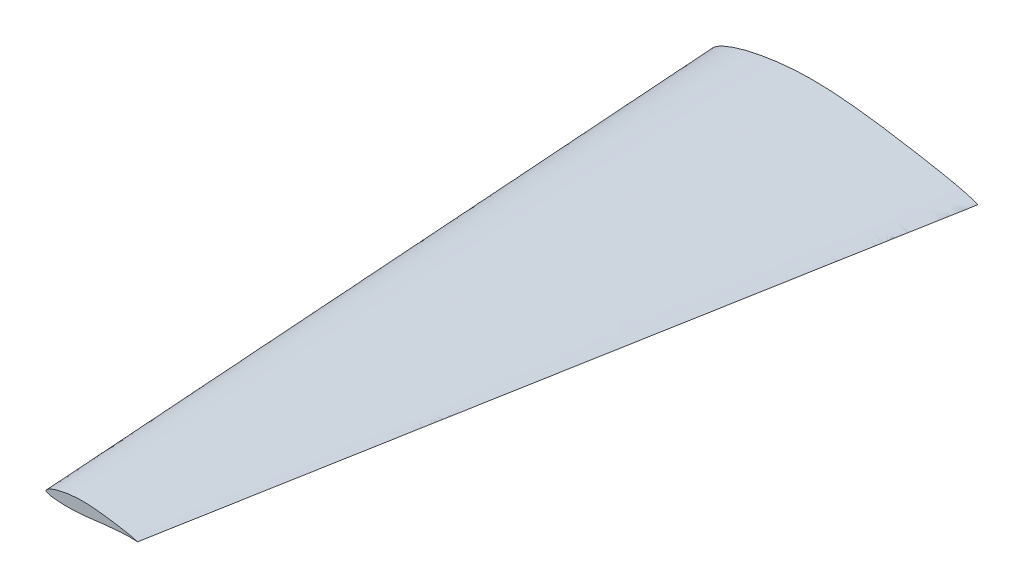
ISO-10303-21;
HEADER;
FILE_DESCRIPTION(('STEP AP214'),'2;1');
FILE_NAME('part.step','',(''),(''),'','','');
FILE_SCHEMA(('AUTOMOTIVE_DESIGN { 1 0 10303 214 1 1 1 1 }'));
ENDSEC;
DATA;
#1=APPLICATION_CONTEXT('core data for automotive mechanical design processes');
#2=APPLICATION_PROTOCOL_DEFINITION('international standard','automotive_design',2000,#1);
#3=PRODUCT_CONTEXT('',#1,'mechanical');
#4=PRODUCT('Part','Part','',(#3));
#5=PRODUCT_RELATED_PRODUCT_CATEGORY('part','',(#4));
#6=PRODUCT_DEFINITION_FORMATION('','',#4);
#7=PRODUCT_DEFINITION_CONTEXT('part definition',#1,'design');
#8=PRODUCT_DEFINITION('design','',#6,#7);
#9=PRODUCT_DEFINITION_SHAPE('','',#8);
#10=(LENGTH_UNIT() NAMED_UNIT(*) SI_UNIT(.MILLI.,.METRE.));
#11=(NAMED_UNIT(*) PLANE_ANGLE_UNIT() SI_UNIT($,.RADIAN.));
#12=(NAMED_UNIT(*) SI_UNIT($,.STERADIAN.) SOLID_ANGLE_UNIT());
#13=UNCERTAINTY_MEASURE_WITH_UNIT(LENGTH_MEASURE(1.E-05),#10,'distance_accuracy_value','');
#14=(GEOMETRIC_REPRESENTATION_CONTEXT(3) GLOBAL_UNCERTAINTY_ASSIGNED_CONTEXT((#13)) GLOBAL_UNIT_ASSIGNED_CONTEXT((#10,
#11,#12)) REPRESENTATION_CONTEXT('',''));
#15=CARTESIAN_POINT('',(0.,0.,0.));
#16=DIRECTION('',(0.,0.,1.));
#17=DIRECTION('',(1.,0.,0.));
#18=AXIS2_PLACEMENT_3D('',#15,#16,#17);
#19=CARTESIAN_POINT('',(-747.653077521207,-40.6182657315667,6200.));
#20=DIRECTION('',(0.,0.,-1.));
#21=DIRECTION('',(-1.,0.,0.));
#22=AXIS2_PLACEMENT_3D('',#19,#20,#21);
#23=PLANE('',#22);
#24=CARTESIAN_POINT('',(46.231204019507,-35.2354448345607,6200.));
#25=CARTESIAN_POINT('',(46.2284405656363,-35.161464044046,6200.));
#26=CARTESIAN_POINT('',(40.5107466597847,-33.7410304315181,6200.));
#27=CARTESIAN_POINT('',(35.095173755005,-31.6670699807893,6200.));
#28=CARTESIAN_POINT('',(22.6401533138637,-27.6181263346662,6200.));
#29=CARTESIAN_POINT('',(7.68738653694873,-23.4228917248776,6200.));
#30=CARTESIAN_POINT('',(-11.6630288456523,-19.1093216631822,6200.));
#31=CARTESIAN_POINT('',(-34.5376973183015,-14.4997928532483,6200.));
#32=CARTESIAN_POINT('',(-60.9676577726097,-9.5372939208794,6200.));
#33=CARTESIAN_POINT('',(-90.4748945702333,-4.29466001199642,6200.));
#34=CARTESIAN_POINT('',(-122.673585589033,1.13715909285272,6200.));
#35=CARTESIAN_POINT('',(-157.103341203516,6.66239247620247,6200.));
#36=CARTESIAN_POINT('',(-193.315298237174,12.1170555043395,6200.));
#37=CARTESIAN_POINT('',(-230.831801501577,17.3685612770775,6200.));
#38=CARTESIAN_POINT('',(-269.195458339637,22.2344819950382,6200.));
#39=CARTESIAN_POINT('',(-307.948301893932,26.5125347132972,6200.));
#40=CARTESIAN_POINT('',(-346.653804819708,30.0334858752315,6200.));
#41=CARTESIAN_POINT('',(-384.937273776908,32.5535580846316,6200.));
#42=CARTESIAN_POINT('',(-422.514475712798,33.7529045585345,6200.));
#43=CARTESIAN_POINT('',(-459.17152624748,33.5367452774346,6200.));
#44=CARTESIAN_POINT('',(-494.752795326995,31.8255847079449,6200.));
#45=CARTESIAN_POINT('',(-529.085531914352,28.6992408412461,6200.));
#46=CARTESIAN_POINT('',(-561.953763146873,24.4271493642645,6200.));
#47=CARTESIAN_POINT('',(-593.076940726259,19.2471852213284,6200.));
#48=CARTESIAN_POINT('',(-622.123955821754,13.2516082607377,6200.));
#49=CARTESIAN_POINT('',(-648.800228679982,6.62191851956731,6200.));
#50=CARTESIAN_POINT('',(-672.832873554333,-0.503051287442359,6200.));
#51=CARTESIAN_POINT('',(-693.96618270177,-7.97014647053786,6200.));
#52=CARTESIAN_POINT('',(-711.995202148996,-15.6130550209624,6200.));
#53=CARTESIAN_POINT('',(-726.74658265942,-23.3233108305785,6200.));
#54=CARTESIAN_POINT('',(-738.094871742379,-30.9123353139702,6200.));
#55=CARTESIAN_POINT('',(-744.610586604553,-36.8048992419908,6200.));
#56=CARTESIAN_POINT('',(-748.201788544685,-41.2650967461758,6200.));
#57=CARTESIAN_POINT('',(-749.850318344285,-43.828182757875,6200.));
#58=CARTESIAN_POINT('',(-750.94828793429,-46.5664283398626,6200.));
#59=CARTESIAN_POINT('',(-751.250483793828,-48.2430082792743,6200.));
#60=CARTESIAN_POINT('',(-751.171358916499,-49.4139312981977,6200.));
#61=CARTESIAN_POINT('',(-750.685133378202,-50.5092914480428,6200.));
#62=CARTESIAN_POINT('',(-749.565856882824,-51.9098735302076,6200.));
#63=CARTESIAN_POINT('',(-747.191277168439,-54.0288947151431,6200.));
#64=CARTESIAN_POINT('',(-742.501078818877,-56.9533147580623,6200.));
#65=CARTESIAN_POINT('',(-733.868548954772,-60.6081626209987,6200.));
#66=CARTESIAN_POINT('',(-720.75844147582,-64.3709023541952,6200.));
#67=CARTESIAN_POINT('',(-703.184436093652,-67.8446748921428,6200.));
#68=CARTESIAN_POINT('',(-681.911582287878,-70.772200095514,6200.));
#69=CARTESIAN_POINT('',(-657.177051439535,-73.2167412462913,6200.));
#70=CARTESIAN_POINT('',(-629.276219223052,-75.1132874538173,6200.));
#71=CARTESIAN_POINT('',(-598.56561876685,-76.4014909147392,6200.));
#72=CARTESIAN_POINT('',(-565.43017274413,-77.0190676374616,6200.));
#73=CARTESIAN_POINT('',(-530.228914169513,-76.8125475071701,6200.));
#74=CARTESIAN_POINT('',(-493.270160843118,-75.5698410912889,6200.));
#75=CARTESIAN_POINT('',(-454.771507600199,-73.1566453823038,6200.));
#76=CARTESIAN_POINT('',(-414.862090680234,-69.4705576020164,6200.));
#77=CARTESIAN_POINT('',(-373.676106035862,-64.6873134822189,6200.));
#78=CARTESIAN_POINT('',(-331.439275690689,-59.4377296716919,6200.));
#79=CARTESIAN_POINT('',(-288.614659582081,-54.0859694749774,6200.));
#80=CARTESIAN_POINT('',(-245.801574741511,-48.9603022904963,6200.));
#81=CARTESIAN_POINT('',(-203.641252257449,-44.2739171415237,6200.));
#82=CARTESIAN_POINT('',(-162.796442142331,-40.2654907769843,6200.));
#83=CARTESIAN_POINT('',(-123.942495214821,-37.0545696704387,6200.));
#84=CARTESIAN_POINT('',(-87.7619223828843,-34.6928701852552,6200.));
#85=CARTESIAN_POINT('',(-54.8545790950461,-33.2402187187982,6200.));
#86=CARTESIAN_POINT('',(-25.9538233844276,-32.5683565258773,6200.));
#87=CARTESIAN_POINT('',(-1.22814621466564,-32.6492910205264,6200.));
#88=CARTESIAN_POINT('',(17.844561028956,-33.0455684548176,6200.));
#89=CARTESIAN_POINT('',(33.4506324915198,-34.0613780335465,6200.));
#90=CARTESIAN_POINT('',(39.9102962245878,-34.3503679361492,6200.));
#91=CARTESIAN_POINT('',(46.2340585822929,-35.311864713945,6200.));
#92=CARTESIAN_POINT('',(46.231204019507,-35.2354448345607,6200.));
#93=B_SPLINE_CURVE_WITH_KNOTS('',3,(#24,#25,#26,#27,#28,#29,#30,#31,#32,#33,#34,#35,#36,#37,#38,
#39,#40,#41,#42,#43,#44,#45,#46,#47,#48,#49,#50,#51,#52,#53,#54,#55,#56,#57,#58,#59,#60,#61,#62,
#63,#64,#65,#66,#67,#68,#69,#70,#71,#72,#73,#74,#75,#76,#77,#78,#79,#80,#81,#82,#83,#84,#85,#86,
#87,#88,#89,#90,#91,#92),.UNSPECIFIED.,.T.,.F.,(4,1,1,1,1,1,1,1,1,1,1,1,1,1,1,1,1,1,1,1,1,1,1,1,
1,1,1,1,1,1,1,1,1,1,1,1,1,1,1,1,1,1,1,1,1,1,1,1,1,1,1,1,1,1,1,1,1,1,1,1,1,1,1,1,1,1,4),(0.,
0.00178025429931348,0.00677661855276226,0.014307631931115,0.0240462466109695,0.0361164032384218,
0.0505469730630571,0.0671298835400742,0.0856244289456062,0.10576729194862,0.127282098412942,
0.149864114045041,0.173229760189317,0.197069077892929,0.221103034083199,0.245051957369849,
0.268663179942347,0.291772797822348,0.314298508345449,0.336177511433891,0.357377359215959,
0.377791670496789,0.397224888102935,0.415489312865215,0.432417328029751,0.447849235180273,
0.461650757544391,0.473686992386839,0.483898395757803,0.492262508108233,0.498796820958936,
0.499955027372734,0.502810607326279,0.504371243067385,0.50535998755193,0.505924933279694,
0.506503368203689,0.507535007041587,0.509204749770686,0.512345281497249,0.517665407870953,
0.526421681932562,0.537424925562334,0.550643204547595,0.565965823835836,0.583206168779579,
0.6021549785986,0.622586582637333,0.644254823208852,0.666997978581174,0.690702845759673,
0.715307475272001,0.740824202204505,0.767084355637659,0.793717038600972,0.82033109971691,
0.846519300878587,0.871863223081629,0.895937170924907,0.918334876492831,0.938667169413558,
0.956573464196435,0.971715275283217,0.983839006179547,0.992717916559063,0.998161052107173,1.),.UNSPECIFIED.);
#94=CARTESIAN_POINT('',(46.231204019507,-35.2354448345607,6200.));
#95=VERTEX_POINT('',#94);
#96=EDGE_CURVE('E11',#95,#95,#93,.T.);
#97=ORIENTED_EDGE('',*,*,#96,.T.);
#98=EDGE_LOOP('',(#97));
#99=FACE_BOUND('',#98,.T.);
#100=ADVANCED_FACE('F49',(#99),#23,.F.);
#101=CARTESIAN_POINT('',(-1152.13318667176,-13.10991310776,0.));
#102=DIRECTION('',(0.,0.,-1.));
#103=DIRECTION('',(-1.,0.,0.));
#104=AXIS2_PLACEMENT_3D('',#101,#102,#103);
#105=PLANE('',#104);
#106=CARTESIAN_POINT('',(1167.2058981927,-30.8287655417814,0.));
#107=CARTESIAN_POINT('',(1167.20094205409,-30.6125348061449,0.));
#108=CARTESIAN_POINT('',(1150.55812547847,-26.2222684266974,0.));
#109=CARTESIAN_POINT('',(1134.82540200827,-19.935632175429,0.));
#110=CARTESIAN_POINT('',(1098.6120870386,-7.58308667640115,0.));
#111=CARTESIAN_POINT('',(1055.10846288295,5.30202759492293,0.));
#112=CARTESIAN_POINT('',(998.763315338816,18.7180818982876,0.));
#113=CARTESIAN_POINT('',(932.135509290922,33.1471605686924,0.));
#114=CARTESIAN_POINT('',(855.136774910614,48.7571140419909,0.));
#115=CARTESIAN_POINT('',(769.160433794038,65.3150377322802,0.));
#116=CARTESIAN_POINT('',(675.329726698728,82.5389939377325,0.));
#117=CARTESIAN_POINT('',(574.985519526962,100.129820104777,0.));
#118=CARTESIAN_POINT('',(469.432133283733,117.589571827369,0.));
#119=CARTESIAN_POINT('',(360.059319501105,134.510811557431,0.));
#120=CARTESIAN_POINT('',(248.195538752362,150.341358991376,0.));
#121=CARTESIAN_POINT('',(135.170092557183,164.471008346329,0.));
#122=CARTESIAN_POINT('',(22.2510450991397,176.387001607296,0.));
#123=CARTESIAN_POINT('',(-89.4773105438022,185.36142647281,0.));
#124=CARTESIAN_POINT('',(-199.198140394845,190.447965807139,0.));
#125=CARTESIAN_POINT('',(-306.290633386234,191.360736000371,0.));
#126=CARTESIAN_POINT('',(-410.303508399844,187.860956850583,0.));
#127=CARTESIAN_POINT('',(-510.728758861772,180.174517107883,0.));
#128=CARTESIAN_POINT('',(-606.924129786052,169.079400162372,0.));
#129=CARTESIAN_POINT('',(-698.060056527238,155.258673151785,0.));
#130=CARTESIAN_POINT('',(-783.165410093493,138.967899254407,0.));
#131=CARTESIAN_POINT('',(-861.372011698718,120.724870890821,0.));
#132=CARTESIAN_POINT('',(-931.876852978271,100.923653640039,0.));
#133=CARTESIAN_POINT('',(-993.926503002303,80.0008743940595,0.));
#134=CARTESIAN_POINT('',(-1046.91523960918,58.4337335558672,0.));
#135=CARTESIAN_POINT('',(-1090.33210191695,36.5317821888165,0.));
#136=CARTESIAN_POINT('',(-1123.8026712494,14.8406154016031,0.));
#137=CARTESIAN_POINT('',(-1143.08475254185,-2.09839090037191,0.));
#138=CARTESIAN_POINT('',(-1153.7633419372,-14.9763351096262,0.));
#139=CARTESIAN_POINT('',(-1158.68703654053,-22.3942325025825,0.));
#140=CARTESIAN_POINT('',(-1162.00980127258,-30.3470028754014,0.));
#141=CARTESIAN_POINT('',(-1162.96321031832,-35.2319349474596,0.));
#142=CARTESIAN_POINT('',(-1162.78139542472,-38.6557944007734,0.));
#143=CARTESIAN_POINT('',(-1161.40716590262,-41.8760675021992,0.));
#144=CARTESIAN_POINT('',(-1158.19651173585,-46.0146296484932,0.));
#145=CARTESIAN_POINT('',(-1151.34910308779,-52.3047930563116,0.));
#146=CARTESIAN_POINT('',(-1137.77118638329,-61.0452534655465,0.));
#147=CARTESIAN_POINT('',(-1112.70761372977,-72.0855309303668,0.));
#148=CARTESIAN_POINT('',(-1074.56858735021,-83.6296075048392,0.));
#149=CARTESIAN_POINT('',(-1023.37735058653,-94.5175934332822,0.));
#150=CARTESIAN_POINT('',(-961.357944689747,-103.965687711033,0.));
#151=CARTESIAN_POINT('',(-889.205864982308,-112.148705326003,0.));
#152=CARTESIAN_POINT('',(-807.781230762513,-118.864291993696,0.));
#153=CARTESIAN_POINT('',(-718.123012274133,-123.92113901691,0.));
#154=CARTESIAN_POINT('',(-621.353030363154,-127.121085721016,0.));
#155=CARTESIAN_POINT('',(-518.513635114154,-128.000687141774,0.));
#156=CARTESIAN_POINT('',(-410.4965568004,-125.92739470241,0.));
#157=CARTESIAN_POINT('',(-297.931780603609,-120.499713058915,0.));
#158=CARTESIAN_POINT('',(-181.192228331441,-111.413060940735,0.));
#159=CARTESIAN_POINT('',(-60.6773192350566,-99.1751483002546,0.));
#160=CARTESIAN_POINT('',(62.9269886556645,-85.6192218943303,0.));
#161=CARTESIAN_POINT('',(188.252653618113,-71.7895767046168,0.));
#162=CARTESIAN_POINT('',(313.535108762903,-58.6199136567897,0.));
#163=CARTESIAN_POINT('',(436.892194820228,-46.7059926617858,0.));
#164=CARTESIAN_POINT('',(556.377817264392,-36.7171224297439,0.));
#165=CARTESIAN_POINT('',(670.014090312546,-28.9740748515905,0.));
#166=CARTESIAN_POINT('',(775.805069390217,-23.5991733728416,0.));
#167=CARTESIAN_POINT('',(871.995923235459,-20.7419146039119,0.));
#168=CARTESIAN_POINT('',(956.449753180622,-19.9967327290336,0.));
#169=CARTESIAN_POINT('',(1028.67553891412,-21.2747573154828,0.));
#170=CARTESIAN_POINT('',(1084.37445965471,-23.2358309601832,0.));
#171=CARTESIAN_POINT('',(1129.92046876616,-26.8606596821739,0.));
#172=CARTESIAN_POINT('',(1148.77840735508,-27.9769839768032,0.));
#173=CARTESIAN_POINT('',(1167.21101773133,-31.0521252358525,0.));
#174=CARTESIAN_POINT('',(1167.2058981927,-30.8287655417814,0.));
#175=B_SPLINE_CURVE_WITH_KNOTS('',3,(#106,#107,#108,#109,#110,#111,#112,#113,#114,#115,#116,
#117,#118,#119,#120,#121,#122,#123,#124,#125,#126,#127,#128,#129,#130,#131,#132,#133,#134,#135,
#136,#137,#138,#139,#140,#141,#142,#143,#144,#145,#146,#147,#148,#149,#150,#151,#152,#153,#154,
#155,#156,#157,#158,#159,#160,#161,#162,#163,#164,#165,#166,#167,#168,#169,#170,#171,#172,#173,
#174),.UNSPECIFIED.,.T.,.F.,(4,1,1,1,1,1,1,1,1,1,1,1,1,1,1,1,1,1,1,1,1,1,1,1,1,1,1,1,1,1,1,1,1,
1,1,1,1,1,1,1,1,1,1,1,1,1,1,1,1,1,1,1,1,1,1,1,1,1,1,1,1,1,1,1,1,1,4),(0.,0.00178025429931348,
0.00677661855276226,0.014307631931115,0.0240462466109695,0.0361164032384218,0.0505469730630571,
0.0671298835400742,0.0856244289456062,0.10576729194862,0.127282098412942,0.149864114045041,
0.173229760189317,0.197069077892929,0.221103034083199,0.245051957369849,0.268663179942347,
0.291772797822348,0.314298508345449,0.336177511433891,0.357377359215959,0.377791670496789,
0.397224888102935,0.415489312865215,0.432417328029751,0.447849235180273,0.461650757544391,
0.473686992386839,0.483898395757803,0.492262508108233,0.498796820958936,0.499955027372734,
0.502810607326279,0.504371243067385,0.50535998755193,0.505924933279694,0.506503368203689,
0.507535007041587,0.509204749770686,0.512345281497249,0.517665407870953,0.526421681932562,
0.537424925562334,0.550643204547595,0.565965823835836,0.583206168779579,0.6021549785986,
0.622586582637333,0.644254823208852,0.666997978581174,0.690702845759673,0.715307475272001,
0.740824202204505,0.767084355637659,0.793717038600972,0.82033109971691,0.846519300878587,
0.871863223081629,0.895937170924907,0.918334876492831,0.938667169413558,0.956573464196435,
0.971715275283217,0.983839006179547,0.992717916559063,0.998161052107173,1.),.UNSPECIFIED.);
#176=CARTESIAN_POINT('',(1167.2058981927,-30.8287655417814,0.));
#177=VERTEX_POINT('',#176);
#178=EDGE_CURVE('E60',#177,#177,#175,.T.);
#179=ORIENTED_EDGE('',*,*,#178,.F.);
#180=EDGE_LOOP('',(#179));
#181=FACE_BOUND('',#180,.T.);
#182=ADVANCED_FACE('F89',(#181),#105,.T.);
#183=CARTESIAN_POINT('',(-1162.80093681062,-35.1631921790562,0.));
#184=CARTESIAN_POINT('',(-751.127407137551,-47.6464509229914,6200.));
#185=CARTESIAN_POINT('',(-1162.82218379801,-35.4148684875712,0.));
#186=CARTESIAN_POINT('',(-751.14142513213,-47.7317010378396,6200.));
#187=CARTESIAN_POINT('',(-1162.87189893173,-36.2284220161607,0.));
#188=CARTESIAN_POINT('',(-751.181479745274,-48.0073492187059,6200.));
#189=CARTESIAN_POINT('',(-1162.84876824659,-37.3870585535843,0.));
#190=CARTESIAN_POINT('',(-751.212003010877,-48.4002126372902,6200.));
#191=CARTESIAN_POINT('',(-1162.61538645023,-38.8260829593911,0.));
#192=CARTESIAN_POINT('',(-751.205936581557,-48.9022365528266,6200.));
#193=CARTESIAN_POINT('',(-1162.20122176191,-40.0153326805554,0.));
#194=CARTESIAN_POINT('',(-751.149350948429,-49.3294659917411,6200.));
#195=CARTESIAN_POINT('',(-1161.5415607564,-41.3501189108856,0.));
#196=CARTESIAN_POINT('',(-750.994737816625,-49.8118201361654,6200.));
#197=CARTESIAN_POINT('',(-1160.49507255786,-43.0517640407889,0.));
#198=CARTESIAN_POINT('',(-750.693102250106,-50.4312829941758,6200.));
#199=CARTESIAN_POINT('',(-1159.10433634,-44.7657984056075,0.));
#200=CARTESIAN_POINT('',(-750.256246487288,-51.0459696479064,6200.));
#201=CARTESIAN_POINT('',(-1156.5731933585,-47.5058416355701,0.));
#202=CARTESIAN_POINT('',(-749.416488376659,-52.0107554517047,6200.));
#203=CARTESIAN_POINT('',(-1154.1769500547,-49.6523307730814,0.));
#204=CARTESIAN_POINT('',(-748.611427802237,-52.7615844367858,6200.));
#205=CARTESIAN_POINT('',(-1148.6375824423,-54.0502698747751,0.));
#206=CARTESIAN_POINT('',(-746.730863479948,-54.2879264972246,6200.));
#207=CARTESIAN_POINT('',(-1143.93790078237,-57.0324125459158,0.));
#208=CARTESIAN_POINT('',(-745.127778881206,-55.3155216976197,6200.));
#209=CARTESIAN_POINT('',(-1132.68502689756,-63.2856607980921,0.));
#210=CARTESIAN_POINT('',(-741.271616253597,-57.4518931681089,6200.));
#211=CARTESIAN_POINT('',(-1124.41666857986,-66.8979562011114,0.));
#212=CARTESIAN_POINT('',(-738.436071417425,-58.6743610617412,6200.));
#213=CARTESIAN_POINT('',(-1104.0799315644,-74.6969930737921,0.));
#214=CARTESIAN_POINT('',(-731.452005928495,-61.2861024299933,6200.));
#215=CARTESIAN_POINT('',(-1090.22169978196,-78.8689057909252,0.));
#216=CARTESIAN_POINT('',(-726.694952758834,-62.6670607253582,6200.));
#217=CARTESIAN_POINT('',(-1060.4278402018,-86.6372366559048,0.));
#218=CARTESIAN_POINT('',(-716.466679165266,-65.2097515079323,6200.));
#219=CARTESIAN_POINT('',(-1042.79647444445,-90.3716143825966,0.));
#220=CARTESIAN_POINT('',(-710.416790483915,-66.4150887779212,6200.));
#221=CARTESIAN_POINT('',(-1005.56620474238,-97.230960043249,0.));
#222=CARTESIAN_POINT('',(-697.644342595635,-68.6007561784582,6200.));
#223=CARTESIAN_POINT('',(-984.279801732776,-100.463443592199,0.));
#224=CARTESIAN_POINT('',(-690.344479221008,-69.6116826334672,6200.));
#225=CARTESIAN_POINT('',(-939.968877173729,-106.391496044778,0.));
#226=CARTESIAN_POINT('',(-675.151371615518,-71.4362702565338,6200.));
#227=CARTESIAN_POINT('',(-915.262534533087,-109.185210548054,0.));
#228=CARTESIAN_POINT('',(-666.682488130611,-72.2773083825788,6200.));
#229=CARTESIAN_POINT('',(-864.426937652912,-114.192374734008,0.));
#230=CARTESIAN_POINT('',(-649.260178746018,-73.7517046735597,6200.));
#231=CARTESIAN_POINT('',(-836.616183644671,-116.479005488935,0.));
#232=CARTESIAN_POINT('',(-639.73101548564,-74.4026274975686,6200.));
#233=CARTESIAN_POINT('',(-779.921918043632,-120.435595606086,0.));
#234=CARTESIAN_POINT('',(-620.308326956115,-75.486802895482,6200.));
#235=CARTESIAN_POINT('',(-749.356989548695,-122.153094567043,0.));
#236=CARTESIAN_POINT('',(-609.839170905086,-75.9286043978483,6200.));
#237=CARTESIAN_POINT('',(-687.526671639854,-124.932885195187,0.));
#238=CARTESIAN_POINT('',(-588.664210241904,-76.5836753733088,6200.));
#239=CARTESIAN_POINT('',(-654.579763498405,-126.015577223397,0.));
#240=CARTESIAN_POINT('',(-577.382832209052,-76.7962945908848,6200.));
#241=CARTESIAN_POINT('',(-588.388676330774,-127.40303499319,0.));
#242=CARTESIAN_POINT('',(-554.722067026049,-76.9537868757262,6200.));
#243=CARTESIAN_POINT('',(-553.463082381829,-127.694050613575,0.));
#244=CARTESIAN_POINT('',(-542.767268643542,-76.8861080190515,6200.));
#245=CARTESIAN_POINT('',(-483.592413040276,-127.330405119437,0.));
#246=CARTESIAN_POINT('',(-518.85553536317,-76.4273586963049,6200.));
#247=CARTESIAN_POINT('',(-446.966886676244,-126.619332334349,0.));
#248=CARTESIAN_POINT('',(-506.323726287629,-76.00875604561,6200.));
#249=CARTESIAN_POINT('',(-373.906113490436,-124.163065893781,0.));
#250=CARTESIAN_POINT('',(-481.330177815911,-74.8185266368609,6200.));
#251=CARTESIAN_POINT('',(-335.792606005059,-122.317057011245,0.));
#252=CARTESIAN_POINT('',(-468.294534369807,-74.0043038696539,6200.));
#253=CARTESIAN_POINT('',(-259.889195452736,-117.538593796299,0.));
#254=CARTESIAN_POINT('',(-442.339202583138,-72.0054456539621,6200.));
#255=CARTESIAN_POINT('',(-220.424449688419,-114.460196449742,0.));
#256=CARTESIAN_POINT('',(-428.847066353092,-70.7622288894901,6200.));
#257=CARTESIAN_POINT('',(-141.813544032135,-107.414278533103,0.));
#258=CARTESIAN_POINT('',(-401.976193920792,-67.9716757541424,6200.));
#259=CARTESIAN_POINT('',(-100.995999182059,-103.26712330858,0.));
#260=CARTESIAN_POINT('',(-388.026457907883,-66.3539298518788,6200.));
#261=CARTESIAN_POINT('',(-19.8959729918267,-94.7025782269162,0.));
#262=CARTESIAN_POINT('',(-360.311756195002,-63.0254702980006,6200.));
#263=CARTESIAN_POINT('',(22.0572868382875,-90.1012921926885,0.));
#264=CARTESIAN_POINT('',(-345.97580160877,-61.2444635221544,6200.));
#265=CARTESIAN_POINT('',(104.877431201199,-80.9900045976973,0.));
#266=CARTESIAN_POINT('',(-317.67543865908,-57.7176072400212,6200.));
#267=CARTESIAN_POINT('',(147.415245349056,-76.2974479994419,0.));
#268=CARTESIAN_POINT('',(-303.140030241952,-55.9011941659093,6200.));
#269=CARTESIAN_POINT('',(230.814160738487,-67.3155208048084,0.));
#270=CARTESIAN_POINT('',(-274.641213520155,-52.4135466090698,6200.));
#271=CARTESIAN_POINT('',(273.34654561888,-62.8469584398096,0.));
#272=CARTESIAN_POINT('',(-260.106661836917,-50.6729356073692,6200.));
#273=CARTESIAN_POINT('',(356.10424868016,-54.5085538151363,0.));
#274=CARTESIAN_POINT('',(-231.824260001459,-47.4074556833747,6200.));
#275=CARTESIAN_POINT('',(398.001483145769,-50.4658204194294,0.));
#276=CARTESIAN_POINT('',(-217.505056961184,-45.8149662759653,6200.));
#277=CARTESIAN_POINT('',(478.837616492646,-43.1994002756613,0.));
#278=CARTESIAN_POINT('',(-189.875157787999,-42.9241781081205,6200.));
#279=CARTESIAN_POINT('',(519.449125211496,-39.808815896065,0.));
#280=CARTESIAN_POINT('',(-175.992823604059,-41.5605567405333,6200.));
#281=CARTESIAN_POINT('',(597.039432074497,-33.9464858219613,0.));
#282=CARTESIAN_POINT('',(-149.466929054913,-39.1653912946596,6200.));
#283=CARTESIAN_POINT('',(635.691758147447,-31.3178571213149,0.));
#284=CARTESIAN_POINT('',(-136.251337683896,-38.0717822114152,6200.));
#285=CARTESIAN_POINT('',(708.697181241306,-27.0087106546781,0.));
#286=CARTESIAN_POINT('',(-111.286803426713,-36.2300900327708,6200.));
#287=CARTESIAN_POINT('',(744.726286704508,-25.1844843466594,0.));
#288=CARTESIAN_POINT('',(-98.9651052741872,-35.4241618480409,6200.));
#289=CARTESIAN_POINT('',(811.896313393692,-22.5271169424411,0.));
#290=CARTESIAN_POINT('',(-75.9899672258875,-34.1751701427918,6200.));
#291=CARTESIAN_POINT('',(844.710262781509,-21.5587233449551,0.));
#292=CARTESIAN_POINT('',(-64.7640727036485,-33.6776603042969,6200.));
#293=CARTESIAN_POINT('',(904.722881392011,-20.4531469298585,0.));
#294=CARTESIAN_POINT('',(-44.2292297655829,-32.9951221570591,6200.));
#295=CARTESIAN_POINT('',(933.614915270421,-20.2064937713281,0.));
#296=CARTESIAN_POINT('',(-34.3430563613789,-32.763382860872,6200.));
#297=CARTESIAN_POINT('',(985.645245963093,-20.5133426517996,0.));
#298=CARTESIAN_POINT('',(-16.5382582317236,-32.6015550028647,6200.));
#299=CARTESIAN_POINT('',(1010.40894688517,-20.9569515974464,0.));
#300=CARTESIAN_POINT('',(-8.05769346037086,-32.6269358813236,6200.));
#301=CARTESIAN_POINT('',(1052.55365181706,-22.1154690793108,0.));
#302=CARTESIAN_POINT('',(6.38583708555751,-32.8090373118029,6200.));
#303=CARTESIAN_POINT('',(1071.81891508838,-22.8098110488612,0.));
#304=CARTESIAN_POINT('',(12.9729042702342,-32.9443490727743,6200.));
#305=CARTESIAN_POINT('',(1105.86292841497,-24.9460141413969,0.));
#306=CARTESIAN_POINT('',(24.5916797934128,-33.4883744378349,6200.));
#307=CARTESIAN_POINT('',(1121.63655147603,-26.1959565127779,0.));
#308=CARTESIAN_POINT('',(30.03006042549,-33.8387307210732,6200.));
#309=CARTESIAN_POINT('',(1140.69335667294,-27.4983771313504,0.));
#310=CARTESIAN_POINT('',(36.6899311496249,-34.2045790935945,6200.));
#311=CARTESIAN_POINT('',(1147.84079960988,-27.9981008544572,0.));
#312=CARTESIAN_POINT('',(39.0340366974602,-34.3111661810945,6200.));
#313=CARTESIAN_POINT('',(1163.45052073251,-30.42475563168,0.));
#314=CARTESIAN_POINT('',(44.0733446394874,-34.9879008816027,6200.));
#315=CARTESIAN_POINT('',(1167.93232742973,-31.1215007100377,0.));
#316=CARTESIAN_POINT('',(45.9272473515707,-35.2652155843534,6200.));
#317=CARTESIAN_POINT('',(1166.33325094202,-30.3836435544886,0.));
#318=CARTESIAN_POINT('',(46.4680358961861,-35.2384187687712,6200.));
#319=CARTESIAN_POINT('',(1161.2442722409,-29.024594269748,0.));
#320=CARTESIAN_POINT('',(45.0244696021425,-34.8623642927802,6200.));
#321=CARTESIAN_POINT('',(1148.2120545959,-25.2848023683636,0.));
#322=CARTESIAN_POINT('',(40.2341206243334,-33.6034333426219,6200.));
#323=CARTESIAN_POINT('',(1142.25005771613,-22.916800229585,0.));
#324=CARTESIAN_POINT('',(38.0794627096275,-32.8099402503357,6200.));
#325=CARTESIAN_POINT('',(1126.12472065244,-16.96778561373,0.));
#326=CARTESIAN_POINT('',(32.6553805949656,-30.8788003993694,6200.));
#327=CARTESIAN_POINT('',(1113.32486640781,-12.6124338111884,0.));
#328=CARTESIAN_POINT('',(28.2853129879629,-29.453284574816,6200.));
#329=CARTESIAN_POINT('',(1086.92159636149,-4.1205404820076,0.));
#330=CARTESIAN_POINT('',(19.1724246219445,-26.6503419030121,6200.));
#331=CARTESIAN_POINT('',(1071.94600026188,0.300240411527605,0.));
#332=CARTESIAN_POINT('',(14.0188966510992,-25.1992967714753,6200.));
#333=CARTESIAN_POINT('',(1039.41748291533,9.03812641609774,0.));
#334=CARTESIAN_POINT('',(2.85974978337416,-22.3526340151024,6200.));
#335=CARTESIAN_POINT('',(1020.10278709425,13.6315317362294,0.));
#336=CARTESIAN_POINT('',(-3.76900719014392,-20.8690469613892,6200.));
#337=CARTESIAN_POINT('',(979.550729393399,22.878805933971,0.));
#338=CARTESIAN_POINT('',(-17.6957510629968,-17.8959063334472,6200.));
#339=CARTESIAN_POINT('',(956.686338927663,27.8267503564571,0.));
#340=CARTESIAN_POINT('',(-25.5456443902167,-16.3118028101146,6200.));
#341=CARTESIAN_POINT('',(909.142474659076,37.8085384952476,0.));
#342=CARTESIAN_POINT('',(-41.8648224263828,-13.1254579178056,6200.));
#343=CARTESIAN_POINT('',(882.801663806097,43.1459171622422,0.));
#344=CARTESIAN_POINT('',(-50.9056937233297,-11.4265319293285,6200.));
#345=CARTESIAN_POINT('',(828.767605392938,53.8354727041483,0.));
#346=CARTESIAN_POINT('',(-69.4513275639072,-8.03099873418249,6200.));
#347=CARTESIAN_POINT('',(799.421575983434,59.4847100989811,0.));
#348=CARTESIAN_POINT('',(-79.5226702293248,-6.24057257240141,6200.));
#349=CARTESIAN_POINT('',(739.759899581921,70.7119224980746,0.));
#350=CARTESIAN_POINT('',(-99.9967162284235,-2.68925721914329,6200.));
#351=CARTESIAN_POINT('',(707.787802745408,76.5786113767624,0.));
#352=CARTESIAN_POINT('',(-110.967871891671,-0.837558427809834,6200.));
#353=CARTESIAN_POINT('',(643.314129890749,88.1514833275713,0.));
#354=CARTESIAN_POINT('',(-133.090718616217,2.8080684098029,6200.));
#355=CARTESIAN_POINT('',(609.155063789181,94.1370211815367,0.));
#356=CARTESIAN_POINT('',(-144.81097819915,4.6897332684965,6200.));
#357=CARTESIAN_POINT('',(540.770148942646,105.789438396151,0.));
#358=CARTESIAN_POINT('',(-168.272744518702,8.34388715992015,6200.));
#359=CARTESIAN_POINT('',(504.884536405658,111.722376626192,0.));
#360=CARTESIAN_POINT('',(-180.583631154224,10.1992648237815,6200.));
#361=CARTESIAN_POINT('',(433.487022724113,123.150696314042,0.));
#362=CARTESIAN_POINT('',(-205.075357182463,13.762168612102,6200.));
#363=CARTESIAN_POINT('',(396.313239717191,128.898232320554,0.));
#364=CARTESIAN_POINT('',(-217.82618550289,15.5480539922229,6200.));
#365=CARTESIAN_POINT('',(322.814345929599,139.781582104013,0.));
#366=CARTESIAN_POINT('',(-243.034336984895,18.9150117197281,6200.));
#367=CARTESIAN_POINT('',(284.824972878614,145.153060385565,0.));
#368=CARTESIAN_POINT('',(-256.062404549643,20.5687284200707,6200.));
#369=CARTESIAN_POINT('',(210.123992235666,155.100796983355,0.));
#370=CARTESIAN_POINT('',(-281.67727664949,23.6107968641405,6200.));
#371=CARTESIAN_POINT('',(171.745512805084,159.893086791191,0.));
#372=CARTESIAN_POINT('',(-294.835635649197,25.0649847446526,6200.));
#373=CARTESIAN_POINT('',(96.70621955741,168.529980342407,0.));
#374=CARTESIAN_POINT('',(-320.55981726333,27.6578998973982,6200.));
#375=CARTESIAN_POINT('',(58.3757788906826,172.567678134436,0.));
#376=CARTESIAN_POINT('',(-333.698000986181,28.8549260035531,6200.));
#377=CARTESIAN_POINT('',(-16.1705938703289,179.473166351753,0.));
#378=CARTESIAN_POINT('',(-359.244905506049,30.8598960825497,6200.));
#379=CARTESIAN_POINT('',(-54.058965393001,182.506744355249,0.));
#380=CARTESIAN_POINT('',(-372.226857307811,31.7168740487757,6200.));
#381=CARTESIAN_POINT('',(-127.448992254084,187.121752683177,0.));
#382=CARTESIAN_POINT('',(-397.366811804777,32.9470106612055,6200.));
#383=CARTESIAN_POINT('',(-164.626196780766,188.834346007167,0.));
#384=CARTESIAN_POINT('',(-410.098991871917,33.356641239308,6200.));
#385=CARTESIAN_POINT('',(-236.415468718096,190.765176351186,0.));
#386=CARTESIAN_POINT('',(-434.678287394496,33.6775423486159,6200.));
#387=CARTESIAN_POINT('',(-272.706452706908,191.062320543712,0.));
#388=CARTESIAN_POINT('',(-447.100446371808,33.6079260164729,6200.));
#389=CARTESIAN_POINT('',(-342.564213532085,190.140218641669,0.));
#390=CARTESIAN_POINT('',(-471.005220483377,32.9635913100783,6200.));
#391=CARTESIAN_POINT('',(-377.81178064964,188.941854459652,0.));
#392=CARTESIAN_POINT('',(-483.063233533356,32.3877545724089,6200.));
#393=CARTESIAN_POINT('',(-445.46769240763,185.169528347952,0.));
#394=CARTESIAN_POINT('',(-506.201080549589,30.7789828114937,6200.));
#395=CARTESIAN_POINT('',(-479.556593177525,182.549213038335,0.));
#396=CARTESIAN_POINT('',(-517.855832222937,29.7218188890459,6200.));
#397=CARTESIAN_POINT('',(-544.691129780064,176.257317418702,0.));
#398=CARTESIAN_POINT('',(-540.118788289106,27.2614685732158,6200.));
#399=CARTESIAN_POINT('',(-577.414316944223,172.472558942099,0.));
#400=CARTESIAN_POINT('',(-551.300593788726,25.8118090283584,6200.));
#401=CARTESIAN_POINT('',(-639.493609112931,164.140251587825,0.));
#402=CARTESIAN_POINT('',(-572.508172184002,22.6670900594036,6200.));
#403=CARTESIAN_POINT('',(-670.522545440925,159.423235881507,0.));
#404=CARTESIAN_POINT('',(-583.105791709451,20.9067263860822,6200.));
#405=CARTESIAN_POINT('',(-728.886946080842,149.357823597283,0.));
#406=CARTESIAN_POINT('',(-603.034084244006,17.1882015011721,6200.));
#407=CARTESIAN_POINT('',(-757.890432247633,143.79392451745,0.));
#408=CARTESIAN_POINT('',(-612.934669547302,15.1483633280053,6200.));
#409=CARTESIAN_POINT('',(-811.926857081547,132.258799480076,0.));
#410=CARTESIAN_POINT('',(-631.375133313428,10.948584902588,6200.));
#411=CARTESIAN_POINT('',(-838.620463171783,126.018346935939,0.));
#412=CARTESIAN_POINT('',(-640.482281189716,8.68912676252112,6200.));
#413=CARTESIAN_POINT('',(-887.766697444238,113.311948639981,0.));
#414=CARTESIAN_POINT('',(-657.244351257422,4.11413113065656,6200.));
#415=CARTESIAN_POINT('',(-911.871750103956,106.525905964949,0.));
#416=CARTESIAN_POINT('',(-665.463564111484,1.68173143428174,6200.));
#417=CARTESIAN_POINT('',(-955.61019281655,92.9209101916263,0.));
#418=CARTESIAN_POINT('',(-680.371919320127,-3.17190918195381,6200.));
#419=CARTESIAN_POINT('',(-976.885714770049,85.7270645755306,0.));
#420=CARTESIAN_POINT('',(-687.621764667123,-5.72845431454161,6200.));
#421=CARTESIAN_POINT('',(-1014.73271526804,71.532461312736,0.));
#422=CARTESIAN_POINT('',(-700.513224708011,-10.7517093635621,6200.));
#423=CARTESIAN_POINT('',(-1032.93397620391,64.0971067527035,0.));
#424=CARTESIAN_POINT('',(-706.711546363912,-13.3731939960453,6200.));
#425=CARTESIAN_POINT('',(-1064.48741340707,49.5693229218913,0.));
#426=CARTESIAN_POINT('',(-717.451731220248,-18.4733617403764,6200.));
#427=CARTESIAN_POINT('',(-1079.45426749648,41.9807192724033,0.));
#428=CARTESIAN_POINT('',(-722.545778818277,-21.1276334701891,6200.));
#429=CARTESIAN_POINT('',(-1104.41450976715,27.4054403447282,0.));
#430=CARTESIAN_POINT('',(-731.037271560184,-26.2043245006221,6200.));
#431=CARTESIAN_POINT('',(-1116.00723379686,19.8353777408332,0.));
#432=CARTESIAN_POINT('',(-734.98203913919,-28.8306679660894,6200.));
#433=CARTESIAN_POINT('',(-1134.27124142093,5.64414052844726,0.));
#434=CARTESIAN_POINT('',(-741.19471559795,-33.7331093397577,6200.));
#435=CARTESIAN_POINT('',(-1142.48281019203,-1.67446842488961,0.));
#436=CARTESIAN_POINT('',(-743.997220987845,-36.2501947799089,6200.));
#437=CARTESIAN_POINT('',(-1150.05757817954,-10.5073348365584,0.));
#438=CARTESIAN_POINT('',(-746.590147530688,-39.2729834142066,6200.));
#439=CARTESIAN_POINT('',(-1151.57061250094,-12.3673196369903,0.));
#440=CARTESIAN_POINT('',(-747.109292328489,-39.908239354684,6200.));
#441=CARTESIAN_POINT('',(-1155.09840892185,-16.9877088244406,0.));
#442=CARTESIAN_POINT('',(-748.32270500573,-41.4831737527192,6200.));
#443=CARTESIAN_POINT('',(-1157.86377785403,-21.2938970643773,0.));
#444=CARTESIAN_POINT('',(-749.284306226337,-42.9481636388296,6200.));
#445=CARTESIAN_POINT('',(-1160.65973821963,-27.1157354475977,0.));
#446=CARTESIAN_POINT('',(-750.272684648343,-44.9240560373193,6200.));
#447=CARTESIAN_POINT('',(-1161.75449619331,-29.9576476035528,0.));
#448=CARTESIAN_POINT('',(-750.675662256429,-45.8865223891553,6200.));
#449=CARTESIAN_POINT('',(-1162.53487659342,-33.1037626602394,0.));
#450=CARTESIAN_POINT('',(-750.98713472871,-46.9492209757362,6200.));
#451=CARTESIAN_POINT('',(-1162.73719478688,-34.4081506789773,0.));
#452=CARTESIAN_POINT('',(-751.085352453431,-47.3906963190849,6200.));
#453=CARTESIAN_POINT('',(-1162.80093681062,-35.1631921790562,0.));
#454=CARTESIAN_POINT('',(-751.127407137551,-47.6464509229914,6200.));
#455=B_SPLINE_SURFACE_WITH_KNOTS('',3,1,((#183,#184),(#185,#186),(#187,#188),(#189,#190),(#191,
#192),(#193,#194),(#195,#196),(#197,#198),(#199,#200),(#201,#202),(#203,#204),(#205,#206),(#207,
#208),(#209,#210),(#211,#212),(#213,#214),(#215,#216),(#217,#218),(#219,#220),(#221,#222),(#223,
#224),(#225,#226),(#227,#228),(#229,#230),(#231,#232),(#233,#234),(#235,#236),(#237,#238),(#239,
#240),(#241,#242),(#243,#244),(#245,#246),(#247,#248),(#249,#250),(#251,#252),(#253,#254),(#255,
#256),(#257,#258),(#259,#260),(#261,#262),(#263,#264),(#265,#266),(#267,#268),(#269,#270),(#271,
#272),(#273,#274),(#275,#276),(#277,#278),(#279,#280),(#281,#282),(#283,#284),(#285,#286),(#287,
#288),(#289,#290),(#291,#292),(#293,#294),(#295,#296),(#297,#298),(#299,#300),(#301,#302),(#303,
#304),(#305,#306),(#307,#308),(#309,#310),(#311,#312),(#313,#314),(#315,#316),(#317,#318),(#319,
#320),(#321,#322),(#323,#324),(#325,#326),(#327,#328),(#329,#330),(#331,#332),(#333,#334),(#335,
#336),(#337,#338),(#339,#340),(#341,#342),(#343,#344),(#345,#346),(#347,#348),(#349,#350),(#351,
#352),(#353,#354),(#355,#356),(#357,#358),(#359,#360),(#361,#362),(#363,#364),(#365,#366),(#367,
#368),(#369,#370),(#371,#372),(#373,#374),(#375,#376),(#377,#378),(#379,#380),(#381,#382),(#383,
#384),(#385,#386),(#387,#388),(#389,#390),(#391,#392),(#393,#394),(#395,#396),(#397,#398),(#399,
#400),(#401,#402),(#403,#404),(#405,#406),(#407,#408),(#409,#410),(#411,#412),(#413,#414),(#415,
#416),(#417,#418),(#419,#420),(#421,#422),(#423,#424),(#425,#426),(#427,#428),(#429,#430),(#431,
#432),(#433,#434),(#435,#436),(#437,#438),(#439,#440),(#441,#442),(#443,#444),(#445,#446),(#447,
#448),(#449,#450),(#451,#452),(#453,#454)),.UNSPECIFIED.,.T.,.F.,.F.,(4,1,1,1,1,1,1,1,1,1,1,1,1,
1,1,1,1,1,1,1,1,1,1,1,1,1,1,1,1,1,1,1,1,1,1,1,1,1,1,1,1,1,1,1,1,1,1,1,1,1,1,1,1,1,1,1,1,1,1,1,1,
1,1,1,1,1,1,1,1,1,1,1,1,1,1,1,1,1,1,1,1,1,1,1,1,1,1,1,1,1,1,1,1,1,1,1,1,1,1,1,1,1,1,1,1,1,1,1,1,
1,1,1,1,1,1,1,1,1,1,1,1,1,1,1,1,1,1,1,1,1,1,1,1,4),(2,2),(0.,0.00015885756575329,
0.000512163850264979,0.000723803293517289,0.00107710957802898,0.00130223821751252,
0.00165554450202421,0.00233387705541099,0.00268718333992268,0.00400361978450947,
0.00435692606902116,0.00714415151107295,0.00749745779558464,0.0124642778847767,
0.0128175841692884,0.0212205519463854,0.0215738582308971,0.032223795576158,0.0325771018606696,
0.0454420745614181,0.0457953808459298,0.0607646938496591,0.0611180001341708,0.0780050387934029,
0.0783583450779146,0.0969538486124235,0.0973071548969352,0.117385452651157,0.117738758935668,
0.139053693222676,0.139406999507187,0.161796848594998,0.16215015487951,0.185501715773496,
0.185855022058008,0.210106345285825,0.210459651570336,0.235623072218329,0.23597637850284,
0.261883225651483,0.262236531935995,0.288515908614795,0.288869214899307,0.315129969730734,
0.315483276015246,0.341318170892411,0.341671477176922,0.366662093095452,0.367015399379964,
0.39073604093873,0.391089347223242,0.413133746506654,0.413487052791166,0.433466039427381,
0.433819345711893,0.451372334210258,0.45172564049477,0.46651414529704,0.466867451581552,
0.47863787619337,0.478991182477882,0.487516786572887,0.487870092857398,0.492959922120996,
0.493313228405508,0.494798870013823,0.495152176298335,0.496579124313137,0.496932430597649,
0.501575488566586,0.501928794851097,0.509106501944939,0.50945980822945,0.518845116624793,
0.519198422909305,0.530915273252245,0.531268579536757,0.545345843076881,0.545699149361392,
0.561928753553898,0.562282059838409,0.58042329895943,0.580776605243941,0.600566161962443,
0.600919468246955,0.622080968426765,0.622434274711277,0.644662984058864,0.645016290343376,
0.668028630203141,0.668381936487652,0.691867947906753,0.692221254191265,0.715901904097022,
0.716255210381534,0.739850827383673,0.740204133668185,0.76346204995617,0.763815356240682,
0.786571667836171,0.786924974120683,0.809097378359273,0.809450684643784,0.830976381447714,
0.831329687732226,0.852176229229782,0.852529535514294,0.872590540510613,0.872943846795124,
0.892023758116759,0.892377064401271,0.910288182879039,0.91064148916355,0.927216198043574,
0.927569504328086,0.942648105194096,0.943001411478608,0.956449627558215,0.956802933842726,
0.968485862400662,0.968839168685174,0.978697265771626,0.979050572056138,0.987061378122057,
0.987414684406568,0.993595690972759,0.993948997257271,0.994753897386558,0.995107203671069,
0.997609477340102,0.997962783624614,0.999170113081209,0.999523419365721,1.),(0.,1.),.UNSPECIFIED.);
#456=ORIENTED_EDGE('',*,*,#178,.T.);
#457=EDGE_LOOP('',(#456));
#458=FACE_BOUND('',#457,.T.);
#459=ORIENTED_EDGE('',*,*,#96,.F.);
#460=EDGE_LOOP('',(#459));
#461=FACE_BOUND('',#460,.T.);
#462=ADVANCED_FACE('F97',(#458,#461),#455,.T.);
#463=CLOSED_SHELL('',(#100,#182,#462));
#464=MANIFOLD_SOLID_BREP('B2',#463);
#465=ADVANCED_BREP_SHAPE_REPRESENTATION('',(#18,#464),#14);
#466=SHAPE_DEFINITION_REPRESENTATION(#9,#465);
ENDSEC;
END-ISO-10303-21;
